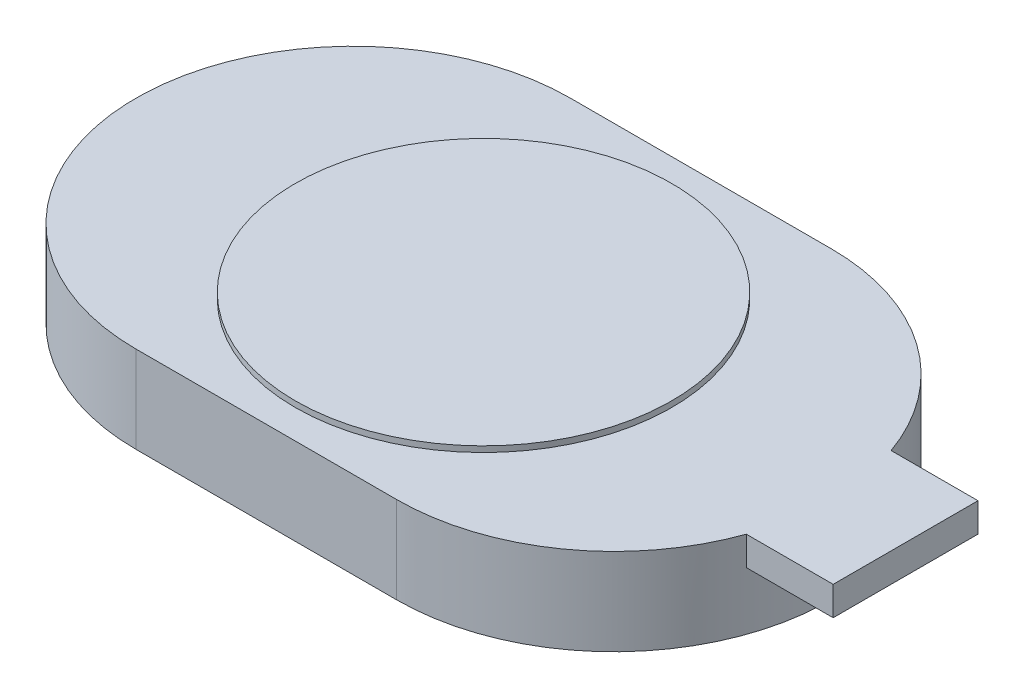
ISO-10303-21;
HEADER;
FILE_DESCRIPTION(('STEP AP214'),'2;1');
FILE_NAME('part.step','',(''),(''),'','','');
FILE_SCHEMA(('AUTOMOTIVE_DESIGN { 1 0 10303 214 1 1 1 1 }'));
ENDSEC;
DATA;
#1=APPLICATION_CONTEXT('core data for automotive mechanical design processes');
#2=APPLICATION_PROTOCOL_DEFINITION('international standard','automotive_design',2000,#1);
#3=PRODUCT_CONTEXT('',#1,'mechanical');
#4=PRODUCT('Part','Part','',(#3));
#5=PRODUCT_RELATED_PRODUCT_CATEGORY('part','',(#4));
#6=PRODUCT_DEFINITION_FORMATION('','',#4);
#7=PRODUCT_DEFINITION_CONTEXT('part definition',#1,'design');
#8=PRODUCT_DEFINITION('design','',#6,#7);
#9=PRODUCT_DEFINITION_SHAPE('','',#8);
#10=(LENGTH_UNIT() NAMED_UNIT(*) SI_UNIT(.MILLI.,.METRE.));
#11=(NAMED_UNIT(*) PLANE_ANGLE_UNIT() SI_UNIT($,.RADIAN.));
#12=(NAMED_UNIT(*) SI_UNIT($,.STERADIAN.) SOLID_ANGLE_UNIT());
#13=UNCERTAINTY_MEASURE_WITH_UNIT(LENGTH_MEASURE(1.E-05),#10,'distance_accuracy_value','');
#14=(GEOMETRIC_REPRESENTATION_CONTEXT(3) GLOBAL_UNCERTAINTY_ASSIGNED_CONTEXT((#13)) GLOBAL_UNIT_ASSIGNED_CONTEXT((#10,
#11,#12)) REPRESENTATION_CONTEXT('',''));
#15=CARTESIAN_POINT('',(0.,0.,0.));
#16=DIRECTION('',(0.,0.,1.));
#17=DIRECTION('',(1.,0.,0.));
#18=AXIS2_PLACEMENT_3D('',#15,#16,#17);
#19=CARTESIAN_POINT('',(-4.5,3.,0.));
#20=DIRECTION('',(0.,-1.,0.));
#21=DIRECTION('',(0.,0.,-1.));
#22=AXIS2_PLACEMENT_3D('',#19,#20,#21);
#23=CYLINDRICAL_SURFACE('',#22,7.5);
#24=CARTESIAN_POINT('',(-4.5,0.,0.));
#25=DIRECTION('',(0.,1.,0.));
#26=DIRECTION('',(0.,0.,1.));
#27=AXIS2_PLACEMENT_3D('',#24,#25,#26);
#28=CIRCLE('',#27,7.5);
#29=CARTESIAN_POINT('',(-4.5,0.,-7.5));
#30=VERTEX_POINT('',#29);
#31=CARTESIAN_POINT('',(-4.5,0.,7.5));
#32=VERTEX_POINT('',#31);
#33=EDGE_CURVE('E151',#30,#32,#28,.T.);
#34=ORIENTED_EDGE('',*,*,#33,.T.);
#35=DIRECTION('',(0.,-1.,0.));
#36=VECTOR('',#35,1.);
#37=CARTESIAN_POINT('',(-4.5,3.,7.5));
#38=LINE('',#37,#36);
#39=CARTESIAN_POINT('',(-4.5,3.,7.5));
#40=VERTEX_POINT('',#39);
#41=EDGE_CURVE('E154',#40,#32,#38,.T.);
#42=ORIENTED_EDGE('',*,*,#41,.F.);
#43=CARTESIAN_POINT('',(-4.5,3.,0.));
#44=DIRECTION('',(0.,1.,0.));
#45=DIRECTION('',(0.,0.,1.));
#46=AXIS2_PLACEMENT_3D('',#43,#44,#45);
#47=CIRCLE('',#46,7.5);
#48=CARTESIAN_POINT('',(-4.5,3.,-7.5));
#49=VERTEX_POINT('',#48);
#50=EDGE_CURVE('E155',#49,#40,#47,.T.);
#51=ORIENTED_EDGE('',*,*,#50,.F.);
#52=DIRECTION('',(0.,-1.,0.));
#53=VECTOR('',#52,1.);
#54=CARTESIAN_POINT('',(-4.5,3.,-7.5));
#55=LINE('',#54,#53);
#56=EDGE_CURVE('E163',#49,#30,#55,.T.);
#57=ORIENTED_EDGE('',*,*,#56,.T.);
#58=EDGE_LOOP('',(#34,#42,#51,#57));
#59=FACE_BOUND('',#58,.T.);
#60=ADVANCED_FACE('F41',(#59),#23,.T.);
#61=CARTESIAN_POINT('',(-4.5,3.,7.5));
#62=DIRECTION('',(0.,0.,-1.));
#63=DIRECTION('',(-1.,0.,0.));
#64=AXIS2_PLACEMENT_3D('',#61,#62,#63);
#65=PLANE('',#64);
#66=DIRECTION('',(1.,0.,0.));
#67=VECTOR('',#66,1.);
#68=CARTESIAN_POINT('',(-4.5,0.,7.5));
#69=LINE('',#68,#67);
#70=CARTESIAN_POINT('',(4.5,0.,7.5));
#71=VERTEX_POINT('',#70);
#72=EDGE_CURVE('E166',#32,#71,#69,.T.);
#73=ORIENTED_EDGE('',*,*,#72,.T.);
#74=DIRECTION('',(0.,-1.,0.));
#75=VECTOR('',#74,1.);
#76=CARTESIAN_POINT('',(4.5,3.,7.5));
#77=LINE('',#76,#75);
#78=CARTESIAN_POINT('',(4.5,3.,7.5));
#79=VERTEX_POINT('',#78);
#80=EDGE_CURVE('E174',#79,#71,#77,.T.);
#81=ORIENTED_EDGE('',*,*,#80,.F.);
#82=DIRECTION('',(1.,0.,0.));
#83=VECTOR('',#82,1.);
#84=CARTESIAN_POINT('',(-4.5,3.,7.5));
#85=LINE('',#84,#83);
#86=EDGE_CURVE('E91',#40,#79,#85,.T.);
#87=ORIENTED_EDGE('',*,*,#86,.F.);
#88=ORIENTED_EDGE('',*,*,#41,.T.);
#89=EDGE_LOOP('',(#73,#81,#87,#88));
#90=FACE_BOUND('',#89,.T.);
#91=ADVANCED_FACE('F177',(#90),#65,.F.);
#92=CARTESIAN_POINT('',(4.5,3.,0.));
#93=DIRECTION('',(0.,-1.,0.));
#94=DIRECTION('',(0.,0.,-1.));
#95=AXIS2_PLACEMENT_3D('',#92,#93,#94);
#96=CYLINDRICAL_SURFACE('',#95,7.5);
#97=CARTESIAN_POINT('',(4.5,2.,0.));
#98=DIRECTION('',(0.,-1.,0.));
#99=DIRECTION('',(0.,0.,-1.));
#100=AXIS2_PLACEMENT_3D('',#97,#98,#99);
#101=CIRCLE('',#100,7.5);
#102=CARTESIAN_POINT('',(11.5710678118655,2.,-2.5));
#103=VERTEX_POINT('',#102);
#104=CARTESIAN_POINT('',(11.5710678118655,2.,2.5));
#105=VERTEX_POINT('',#104);
#106=EDGE_CURVE('E11',#103,#105,#101,.T.);
#107=ORIENTED_EDGE('',*,*,#106,.T.);
#108=DIRECTION('',(0.,1.,0.));
#109=VECTOR('',#108,1.);
#110=CARTESIAN_POINT('',(11.5710678118655,2.,2.5));
#111=LINE('',#110,#109);
#112=CARTESIAN_POINT('',(11.5710678118655,3.,2.5));
#113=VERTEX_POINT('',#112);
#114=EDGE_CURVE('E145',#105,#113,#111,.T.);
#115=ORIENTED_EDGE('',*,*,#114,.T.);
#116=CARTESIAN_POINT('',(4.5,3.,0.));
#117=DIRECTION('',(0.,1.,0.));
#118=DIRECTION('',(0.,0.,1.));
#119=AXIS2_PLACEMENT_3D('',#116,#117,#118);
#120=CIRCLE('',#119,7.5);
#121=EDGE_CURVE('E159',#79,#113,#120,.T.);
#122=ORIENTED_EDGE('',*,*,#121,.F.);
#123=ORIENTED_EDGE('',*,*,#80,.T.);
#124=CARTESIAN_POINT('',(4.5,0.,0.));
#125=DIRECTION('',(0.,1.,0.));
#126=DIRECTION('',(0.,0.,1.));
#127=AXIS2_PLACEMENT_3D('',#124,#125,#126);
#128=CIRCLE('',#127,7.5);
#129=CARTESIAN_POINT('',(4.5,0.,-7.5));
#130=VERTEX_POINT('',#129);
#131=EDGE_CURVE('E168',#71,#130,#128,.T.);
#132=ORIENTED_EDGE('',*,*,#131,.T.);
#133=DIRECTION('',(0.,-1.,0.));
#134=VECTOR('',#133,1.);
#135=CARTESIAN_POINT('',(4.5,3.,-7.5));
#136=LINE('',#135,#134);
#137=CARTESIAN_POINT('',(4.5,3.,-7.5));
#138=VERTEX_POINT('',#137);
#139=EDGE_CURVE('E172',#138,#130,#136,.T.);
#140=ORIENTED_EDGE('',*,*,#139,.F.);
#141=CARTESIAN_POINT('',(11.5710678118655,3.,-2.5));
#142=VERTEX_POINT('',#141);
#143=EDGE_CURVE('E158',#142,#138,#120,.T.);
#144=ORIENTED_EDGE('',*,*,#143,.F.);
#145=DIRECTION('',(0.,1.,0.));
#146=VECTOR('',#145,1.);
#147=CARTESIAN_POINT('',(11.5710678118655,2.,-2.5));
#148=LINE('',#147,#146);
#149=EDGE_CURVE('E122',#103,#142,#148,.T.);
#150=ORIENTED_EDGE('',*,*,#149,.F.);
#151=EDGE_LOOP('',(#107,#115,#122,#123,#132,#140,#144,#150));
#152=FACE_BOUND('',#151,.T.);
#153=ADVANCED_FACE('F186',(#152),#96,.T.);
#154=CARTESIAN_POINT('',(-4.5,3.,-7.5));
#155=DIRECTION('',(0.,0.,1.));
#156=DIRECTION('',(1.,0.,0.));
#157=AXIS2_PLACEMENT_3D('',#154,#155,#156);
#158=PLANE('',#157);
#159=DIRECTION('',(-1.,0.,0.));
#160=VECTOR('',#159,1.);
#161=CARTESIAN_POINT('',(-4.5,0.,-7.5));
#162=LINE('',#161,#160);
#163=EDGE_CURVE('E83',#130,#30,#162,.T.);
#164=ORIENTED_EDGE('',*,*,#163,.T.);
#165=ORIENTED_EDGE('',*,*,#56,.F.);
#166=DIRECTION('',(-1.,0.,0.));
#167=VECTOR('',#166,1.);
#168=CARTESIAN_POINT('',(-4.5,3.,-7.5));
#169=LINE('',#168,#167);
#170=EDGE_CURVE('E62',#138,#49,#169,.T.);
#171=ORIENTED_EDGE('',*,*,#170,.F.);
#172=ORIENTED_EDGE('',*,*,#139,.T.);
#173=EDGE_LOOP('',(#164,#165,#171,#172));
#174=FACE_BOUND('',#173,.T.);
#175=ADVANCED_FACE('F189',(#174),#158,.F.);
#176=CARTESIAN_POINT('',(-4.5,3.,0.));
#177=DIRECTION('',(0.,1.,0.));
#178=DIRECTION('',(0.,0.,1.));
#179=AXIS2_PLACEMENT_3D('',#176,#177,#178);
#180=PLANE('',#179);
#181=ORIENTED_EDGE('',*,*,#121,.T.);
#182=DIRECTION('',(1.,0.,0.));
#183=VECTOR('',#182,1.);
#184=CARTESIAN_POINT('',(14.5710678118655,3.,2.5));
#185=LINE('',#184,#183);
#186=CARTESIAN_POINT('',(14.5710678118655,3.,2.5));
#187=VERTEX_POINT('',#186);
#188=EDGE_CURVE('E134',#113,#187,#185,.T.);
#189=ORIENTED_EDGE('',*,*,#188,.T.);
#190=DIRECTION('',(0.,0.,-1.));
#191=VECTOR('',#190,1.);
#192=CARTESIAN_POINT('',(14.5710678118655,3.,-2.5));
#193=LINE('',#192,#191);
#194=CARTESIAN_POINT('',(14.5710678118655,3.,-2.5));
#195=VERTEX_POINT('',#194);
#196=EDGE_CURVE('E140',#187,#195,#193,.T.);
#197=ORIENTED_EDGE('',*,*,#196,.T.);
#198=DIRECTION('',(-1.,0.,0.));
#199=VECTOR('',#198,1.);
#200=CARTESIAN_POINT('',(14.5710678118655,3.,-2.5));
#201=LINE('',#200,#199);
#202=EDGE_CURVE('E55',#195,#142,#201,.T.);
#203=ORIENTED_EDGE('',*,*,#202,.T.);
#204=ORIENTED_EDGE('',*,*,#143,.T.);
#205=ORIENTED_EDGE('',*,*,#170,.T.);
#206=ORIENTED_EDGE('',*,*,#50,.T.);
#207=ORIENTED_EDGE('',*,*,#86,.T.);
#208=EDGE_LOOP('',(#181,#189,#197,#203,#204,#205,#206,#207));
#209=FACE_BOUND('',#208,.T.);
#210=CARTESIAN_POINT('',(0.,3.,0.));
#211=DIRECTION('',(0.,1.,0.));
#212=DIRECTION('',(0.,0.,1.));
#213=AXIS2_PLACEMENT_3D('',#210,#211,#212);
#214=CIRCLE('',#213,6.5);
#215=CARTESIAN_POINT('',(0.,3.,6.5));
#216=VERTEX_POINT('',#215);
#217=EDGE_CURVE('E48',#216,#216,#214,.T.);
#218=ORIENTED_EDGE('',*,*,#217,.F.);
#219=EDGE_LOOP('',(#218));
#220=FACE_BOUND('',#219,.T.);
#221=ADVANCED_FACE('F190',(#209,#220),#180,.T.);
#222=CARTESIAN_POINT('',(-4.5,0.,0.));
#223=DIRECTION('',(0.,1.,0.));
#224=DIRECTION('',(0.,0.,1.));
#225=AXIS2_PLACEMENT_3D('',#222,#223,#224);
#226=PLANE('',#225);
#227=ORIENTED_EDGE('',*,*,#33,.F.);
#228=ORIENTED_EDGE('',*,*,#163,.F.);
#229=ORIENTED_EDGE('',*,*,#131,.F.);
#230=ORIENTED_EDGE('',*,*,#72,.F.);
#231=EDGE_LOOP('',(#227,#228,#229,#230));
#232=FACE_BOUND('',#231,.T.);
#233=ADVANCED_FACE('F182',(#232),#226,.F.);
#234=CARTESIAN_POINT('',(0.,3.2,0.));
#235=DIRECTION('',(0.,-1.,0.));
#236=DIRECTION('',(0.,0.,-1.));
#237=AXIS2_PLACEMENT_3D('',#234,#235,#236);
#238=CYLINDRICAL_SURFACE('',#237,6.5);
#239=CARTESIAN_POINT('',(0.,3.2,0.));
#240=DIRECTION('',(0.,1.,0.));
#241=DIRECTION('',(0.,0.,1.));
#242=AXIS2_PLACEMENT_3D('',#239,#240,#241);
#243=CIRCLE('',#242,6.5);
#244=CARTESIAN_POINT('',(0.,3.2,6.5));
#245=VERTEX_POINT('',#244);
#246=EDGE_CURVE('E144',#245,#245,#243,.T.);
#247=ORIENTED_EDGE('',*,*,#246,.F.);
#248=EDGE_LOOP('',(#247));
#249=FACE_BOUND('',#248,.T.);
#250=ORIENTED_EDGE('',*,*,#217,.T.);
#251=EDGE_LOOP('',(#250));
#252=FACE_BOUND('',#251,.T.);
#253=ADVANCED_FACE('F217',(#249,#252),#238,.T.);
#254=CARTESIAN_POINT('',(0.,3.2,0.));
#255=DIRECTION('',(0.,1.,0.));
#256=DIRECTION('',(0.,0.,1.));
#257=AXIS2_PLACEMENT_3D('',#254,#255,#256);
#258=PLANE('',#257);
#259=ORIENTED_EDGE('',*,*,#246,.T.);
#260=EDGE_LOOP('',(#259));
#261=FACE_BOUND('',#260,.T.);
#262=ADVANCED_FACE('F201',(#261),#258,.T.);
#263=CARTESIAN_POINT('',(14.5710678118655,2.,-2.5));
#264=DIRECTION('',(1.,0.,0.));
#265=DIRECTION('',(0.,0.,-1.));
#266=AXIS2_PLACEMENT_3D('',#263,#264,#265);
#267=PLANE('',#266);
#268=ORIENTED_EDGE('',*,*,#196,.F.);
#269=DIRECTION('',(0.,1.,0.));
#270=VECTOR('',#269,1.);
#271=CARTESIAN_POINT('',(14.5710678118655,2.,2.5));
#272=LINE('',#271,#270);
#273=CARTESIAN_POINT('',(14.5710678118655,2.,2.5));
#274=VERTEX_POINT('',#273);
#275=EDGE_CURVE('E133',#274,#187,#272,.T.);
#276=ORIENTED_EDGE('',*,*,#275,.F.);
#277=DIRECTION('',(0.,0.,-1.));
#278=VECTOR('',#277,1.);
#279=CARTESIAN_POINT('',(14.5710678118655,2.,-2.5));
#280=LINE('',#279,#278);
#281=CARTESIAN_POINT('',(14.5710678118655,2.,-2.5));
#282=VERTEX_POINT('',#281);
#283=EDGE_CURVE('E129',#274,#282,#280,.T.);
#284=ORIENTED_EDGE('',*,*,#283,.T.);
#285=DIRECTION('',(0.,1.,0.));
#286=VECTOR('',#285,1.);
#287=CARTESIAN_POINT('',(14.5710678118655,2.,-2.5));
#288=LINE('',#287,#286);
#289=EDGE_CURVE('E114',#282,#195,#288,.T.);
#290=ORIENTED_EDGE('',*,*,#289,.T.);
#291=EDGE_LOOP('',(#268,#276,#284,#290));
#292=FACE_BOUND('',#291,.T.);
#293=ADVANCED_FACE('F132',(#292),#267,.T.);
#294=CARTESIAN_POINT('',(14.5710678118655,2.,2.5));
#295=DIRECTION('',(0.,0.,1.));
#296=DIRECTION('',(1.,0.,0.));
#297=AXIS2_PLACEMENT_3D('',#294,#295,#296);
#298=PLANE('',#297);
#299=ORIENTED_EDGE('',*,*,#188,.F.);
#300=ORIENTED_EDGE('',*,*,#114,.F.);
#301=DIRECTION('',(1.,0.,0.));
#302=VECTOR('',#301,1.);
#303=CARTESIAN_POINT('',(14.5710678118655,2.,2.5));
#304=LINE('',#303,#302);
#305=EDGE_CURVE('E123',#105,#274,#304,.T.);
#306=ORIENTED_EDGE('',*,*,#305,.T.);
#307=ORIENTED_EDGE('',*,*,#275,.T.);
#308=EDGE_LOOP('',(#299,#300,#306,#307));
#309=FACE_BOUND('',#308,.T.);
#310=ADVANCED_FACE('F193',(#309),#298,.T.);
#311=CARTESIAN_POINT('',(14.5710678118655,2.,-2.5));
#312=DIRECTION('',(0.,0.,-1.));
#313=DIRECTION('',(-1.,0.,0.));
#314=AXIS2_PLACEMENT_3D('',#311,#312,#313);
#315=PLANE('',#314);
#316=ORIENTED_EDGE('',*,*,#202,.F.);
#317=ORIENTED_EDGE('',*,*,#289,.F.);
#318=DIRECTION('',(-1.,0.,0.));
#319=VECTOR('',#318,1.);
#320=CARTESIAN_POINT('',(14.5710678118655,2.,-2.5));
#321=LINE('',#320,#319);
#322=EDGE_CURVE('E117',#282,#103,#321,.T.);
#323=ORIENTED_EDGE('',*,*,#322,.T.);
#324=ORIENTED_EDGE('',*,*,#149,.T.);
#325=EDGE_LOOP('',(#316,#317,#323,#324));
#326=FACE_BOUND('',#325,.T.);
#327=ADVANCED_FACE('F116',(#326),#315,.T.);
#328=CARTESIAN_POINT('',(0.,2.,0.));
#329=DIRECTION('',(0.,-1.,0.));
#330=DIRECTION('',(0.,0.,-1.));
#331=AXIS2_PLACEMENT_3D('',#328,#329,#330);
#332=PLANE('',#331);
#333=ORIENTED_EDGE('',*,*,#106,.F.);
#334=ORIENTED_EDGE('',*,*,#322,.F.);
#335=ORIENTED_EDGE('',*,*,#283,.F.);
#336=ORIENTED_EDGE('',*,*,#305,.F.);
#337=EDGE_LOOP('',(#333,#334,#335,#336));
#338=FACE_BOUND('',#337,.T.);
#339=ADVANCED_FACE('F127',(#338),#332,.T.);
#340=CLOSED_SHELL('',(#60,#91,#153,#175,#221,#233,#253,#262,#293,#310,#327,#339));
#341=MANIFOLD_SOLID_BREP('B2',#340);
#342=ADVANCED_BREP_SHAPE_REPRESENTATION('',(#18,#341),#14);
#343=SHAPE_DEFINITION_REPRESENTATION(#9,#342);
ENDSEC;
END-ISO-10303-21;
